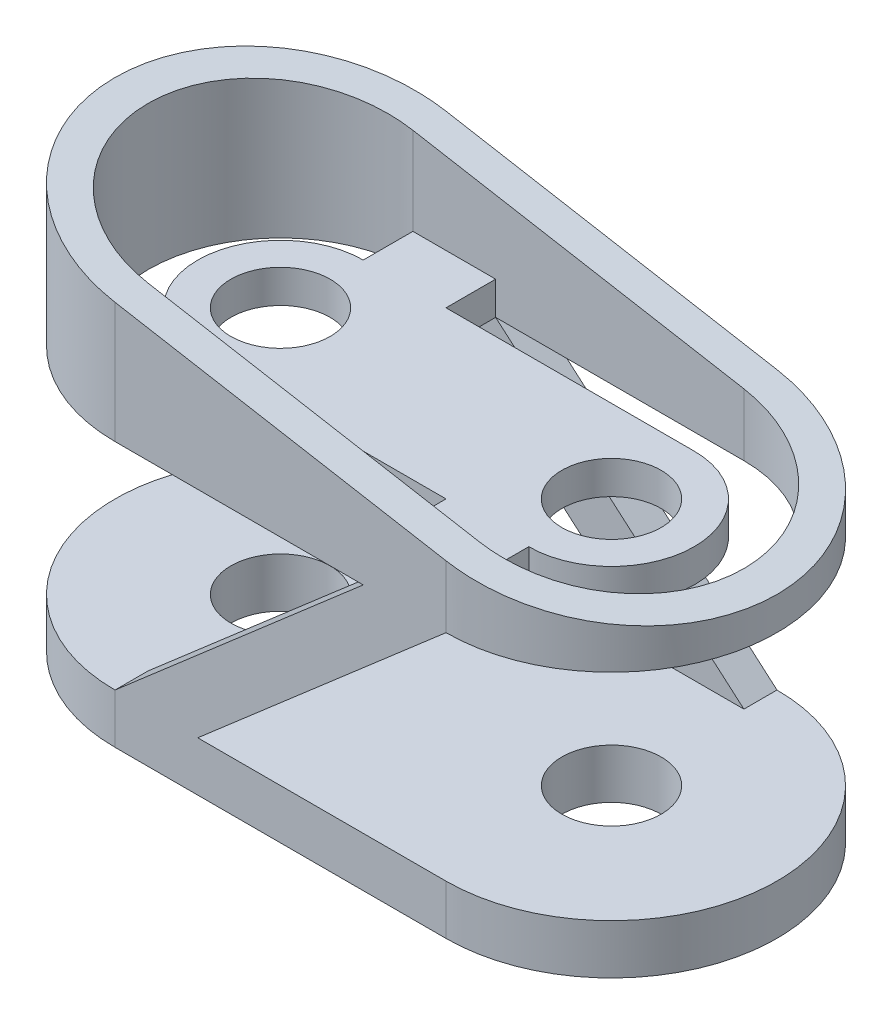
ISO-10303-21;
HEADER;
FILE_DESCRIPTION(('STEP AP214'),'2;1');
FILE_NAME('part.step','',(''),(''),'','','');
FILE_SCHEMA(('AUTOMOTIVE_DESIGN { 1 0 10303 214 1 1 1 1 }'));
ENDSEC;
DATA;
#1=APPLICATION_CONTEXT('core data for automotive mechanical design processes');
#2=APPLICATION_PROTOCOL_DEFINITION('international standard','automotive_design',2000,#1);
#3=PRODUCT_CONTEXT('',#1,'mechanical');
#4=PRODUCT('Part','Part','',(#3));
#5=PRODUCT_RELATED_PRODUCT_CATEGORY('part','',(#4));
#6=PRODUCT_DEFINITION_FORMATION('','',#4);
#7=PRODUCT_DEFINITION_CONTEXT('part definition',#1,'design');
#8=PRODUCT_DEFINITION('design','',#6,#7);
#9=PRODUCT_DEFINITION_SHAPE('','',#8);
#10=(LENGTH_UNIT() NAMED_UNIT(*) SI_UNIT(.MILLI.,.METRE.));
#11=(NAMED_UNIT(*) PLANE_ANGLE_UNIT() SI_UNIT($,.RADIAN.));
#12=(NAMED_UNIT(*) SI_UNIT($,.STERADIAN.) SOLID_ANGLE_UNIT());
#13=UNCERTAINTY_MEASURE_WITH_UNIT(LENGTH_MEASURE(1.E-05),#10,'distance_accuracy_value','');
#14=(GEOMETRIC_REPRESENTATION_CONTEXT(3) GLOBAL_UNCERTAINTY_ASSIGNED_CONTEXT((#13)) GLOBAL_UNIT_ASSIGNED_CONTEXT((#10,
#11,#12)) REPRESENTATION_CONTEXT('',''));
#15=CARTESIAN_POINT('',(0.,0.,0.));
#16=DIRECTION('',(0.,0.,1.));
#17=DIRECTION('',(1.,0.,0.));
#18=AXIS2_PLACEMENT_3D('',#15,#16,#17);
#19=CARTESIAN_POINT('',(-50.,90.,0.));
#20=DIRECTION('',(0.,1.,0.));
#21=DIRECTION('',(0.,0.,1.));
#22=AXIS2_PLACEMENT_3D('',#19,#20,#21);
#23=PLANE('',#22);
#24=CARTESIAN_POINT('',(-50.,90.,0.));
#25=DIRECTION('',(0.,1.,0.));
#26=DIRECTION('',(0.,0.,1.));
#27=AXIS2_PLACEMENT_3D('',#24,#25,#26);
#28=CIRCLE('',#27,15.);
#29=CARTESIAN_POINT('',(-50.,90.,15.));
#30=VERTEX_POINT('',#29);
#31=EDGE_CURVE('E312',#30,#30,#28,.T.);
#32=ORIENTED_EDGE('',*,*,#31,.F.);
#33=EDGE_LOOP('',(#32));
#34=FACE_BOUND('',#33,.T.);
#35=CARTESIAN_POINT('',(50.,90.,0.));
#36=DIRECTION('',(0.,1.,0.));
#37=DIRECTION('',(0.,0.,1.));
#38=AXIS2_PLACEMENT_3D('',#35,#36,#37);
#39=CIRCLE('',#38,15.);
#40=CARTESIAN_POINT('',(50.,90.,15.));
#41=VERTEX_POINT('',#40);
#42=EDGE_CURVE('E306',#41,#41,#39,.T.);
#43=ORIENTED_EDGE('',*,*,#42,.F.);
#44=EDGE_LOOP('',(#43));
#45=FACE_BOUND('',#44,.T.);
#46=DIRECTION('',(0.,0.,-1.));
#47=VECTOR('',#46,1.);
#48=CARTESIAN_POINT('',(25.,90.,50.));
#49=LINE('',#48,#47);
#50=CARTESIAN_POINT('',(25.,90.,40.));
#51=VERTEX_POINT('',#50);
#52=CARTESIAN_POINT('',(25.,90.,25.));
#53=VERTEX_POINT('',#52);
#54=EDGE_CURVE('E375',#51,#53,#49,.T.);
#55=ORIENTED_EDGE('',*,*,#54,.F.);
#56=DIRECTION('',(1.,0.,0.));
#57=VECTOR('',#56,1.);
#58=CARTESIAN_POINT('',(-50.,90.,40.));
#59=LINE('',#58,#57);
#60=CARTESIAN_POINT('',(50.,90.,40.));
#61=VERTEX_POINT('',#60);
#62=EDGE_CURVE('E298',#51,#61,#59,.T.);
#63=ORIENTED_EDGE('',*,*,#62,.T.);
#64=DIRECTION('',(0.,0.,1.));
#65=VECTOR('',#64,1.);
#66=CARTESIAN_POINT('',(50.,90.,25.));
#67=LINE('',#66,#65);
#68=CARTESIAN_POINT('',(50.,90.,25.));
#69=VERTEX_POINT('',#68);
#70=EDGE_CURVE('E371',#69,#61,#67,.T.);
#71=ORIENTED_EDGE('',*,*,#70,.F.);
#72=CARTESIAN_POINT('',(50.,90.,0.));
#73=DIRECTION('',(0.,1.,0.));
#74=DIRECTION('',(0.,0.,1.));
#75=AXIS2_PLACEMENT_3D('',#72,#73,#74);
#76=CIRCLE('',#75,25.);
#77=CARTESIAN_POINT('',(50.,90.,-25.));
#78=VERTEX_POINT('',#77);
#79=EDGE_CURVE('E367',#69,#78,#76,.T.);
#80=ORIENTED_EDGE('',*,*,#79,.T.);
#81=DIRECTION('',(-1.,0.,0.));
#82=VECTOR('',#81,1.);
#83=CARTESIAN_POINT('',(50.,90.,-25.));
#84=LINE('',#83,#82);
#85=CARTESIAN_POINT('',(-25.,90.,-25.));
#86=VERTEX_POINT('',#85);
#87=EDGE_CURVE('E363',#78,#86,#84,.T.);
#88=ORIENTED_EDGE('',*,*,#87,.T.);
#89=DIRECTION('',(0.,0.,-1.));
#90=VECTOR('',#89,1.);
#91=CARTESIAN_POINT('',(-25.,90.,-25.));
#92=LINE('',#91,#90);
#93=CARTESIAN_POINT('',(-25.,90.,-40.));
#94=VERTEX_POINT('',#93);
#95=EDGE_CURVE('E359',#86,#94,#92,.T.);
#96=ORIENTED_EDGE('',*,*,#95,.T.);
#97=DIRECTION('',(-1.,0.,0.));
#98=VECTOR('',#97,1.);
#99=CARTESIAN_POINT('',(-50.,90.,-40.));
#100=LINE('',#99,#98);
#101=CARTESIAN_POINT('',(-50.,90.,-40.));
#102=VERTEX_POINT('',#101);
#103=EDGE_CURVE('E303',#94,#102,#100,.T.);
#104=ORIENTED_EDGE('',*,*,#103,.T.);
#105=DIRECTION('',(0.,0.,-1.));
#106=VECTOR('',#105,1.);
#107=CARTESIAN_POINT('',(-50.,90.,-25.));
#108=LINE('',#107,#106);
#109=CARTESIAN_POINT('',(-50.,90.,-25.));
#110=VERTEX_POINT('',#109);
#111=EDGE_CURVE('E311',#110,#102,#108,.T.);
#112=ORIENTED_EDGE('',*,*,#111,.F.);
#113=CARTESIAN_POINT('',(-50.,90.,0.));
#114=DIRECTION('',(0.,1.,0.));
#115=DIRECTION('',(0.,0.,1.));
#116=AXIS2_PLACEMENT_3D('',#113,#114,#115);
#117=CIRCLE('',#116,25.);
#118=CARTESIAN_POINT('',(-50.,90.,25.));
#119=VERTEX_POINT('',#118);
#120=EDGE_CURVE('E328',#110,#119,#117,.T.);
#121=ORIENTED_EDGE('',*,*,#120,.T.);
#122=DIRECTION('',(1.,0.,0.));
#123=VECTOR('',#122,1.);
#124=CARTESIAN_POINT('',(-50.,90.,25.));
#125=LINE('',#124,#123);
#126=EDGE_CURVE('E378',#119,#53,#125,.T.);
#127=ORIENTED_EDGE('',*,*,#126,.T.);
#128=EDGE_LOOP('',(#55,#63,#71,#80,#88,#96,#104,#112,#121,#127));
#129=FACE_BOUND('',#128,.T.);
#130=ADVANCED_FACE('F84',(#34,#45,#129),#23,.T.);
#131=CARTESIAN_POINT('',(-50.,80.,-25.));
#132=DIRECTION('',(1.,0.,0.));
#133=DIRECTION('',(0.,0.,-1.));
#134=AXIS2_PLACEMENT_3D('',#131,#132,#133);
#135=PLANE('',#134);
#136=DIRECTION('',(0.,1.,0.));
#137=VECTOR('',#136,1.);
#138=CARTESIAN_POINT('',(-50.,80.,-40.));
#139=LINE('',#138,#137);
#140=CARTESIAN_POINT('',(-50.,80.,-40.));
#141=VERTEX_POINT('',#140);
#142=EDGE_CURVE('E277',#141,#102,#139,.T.);
#143=ORIENTED_EDGE('',*,*,#142,.F.);
#144=DIRECTION('',(0.,0.,-1.));
#145=VECTOR('',#144,1.);
#146=CARTESIAN_POINT('',(-50.,80.,-25.));
#147=LINE('',#146,#145);
#148=CARTESIAN_POINT('',(-50.,80.,-25.));
#149=VERTEX_POINT('',#148);
#150=EDGE_CURVE('E323',#149,#141,#147,.T.);
#151=ORIENTED_EDGE('',*,*,#150,.F.);
#152=DIRECTION('',(0.,1.,0.));
#153=VECTOR('',#152,1.);
#154=CARTESIAN_POINT('',(-50.,80.,-25.));
#155=LINE('',#154,#153);
#156=EDGE_CURVE('E355',#149,#110,#155,.T.);
#157=ORIENTED_EDGE('',*,*,#156,.T.);
#158=ORIENTED_EDGE('',*,*,#111,.T.);
#159=EDGE_LOOP('',(#143,#151,#157,#158));
#160=FACE_BOUND('',#159,.T.);
#161=ADVANCED_FACE('F563',(#160),#135,.F.);
#162=CARTESIAN_POINT('',(25.,80.,50.));
#163=DIRECTION('',(1.,0.,0.));
#164=DIRECTION('',(0.,0.,-1.));
#165=AXIS2_PLACEMENT_3D('',#162,#163,#164);
#166=PLANE('',#165);
#167=DIRECTION('',(0.,-1.,0.));
#168=VECTOR('',#167,1.);
#169=CARTESIAN_POINT('',(25.,80.,40.));
#170=LINE('',#169,#168);
#171=CARTESIAN_POINT('',(25.,80.,40.));
#172=VERTEX_POINT('',#171);
#173=EDGE_CURVE('E295',#51,#172,#170,.T.);
#174=ORIENTED_EDGE('',*,*,#173,.F.);
#175=ORIENTED_EDGE('',*,*,#54,.T.);
#176=DIRECTION('',(0.,1.,0.));
#177=VECTOR('',#176,1.);
#178=CARTESIAN_POINT('',(25.,80.,25.));
#179=LINE('',#178,#177);
#180=CARTESIAN_POINT('',(25.,80.,25.));
#181=VERTEX_POINT('',#180);
#182=EDGE_CURVE('E390',#181,#53,#179,.T.);
#183=ORIENTED_EDGE('',*,*,#182,.F.);
#184=DIRECTION('',(0.,0.,-1.));
#185=VECTOR('',#184,1.);
#186=CARTESIAN_POINT('',(25.,80.,50.));
#187=LINE('',#186,#185);
#188=EDGE_CURVE('E343',#172,#181,#187,.T.);
#189=ORIENTED_EDGE('',*,*,#188,.F.);
#190=EDGE_LOOP('',(#174,#175,#183,#189));
#191=FACE_BOUND('',#190,.T.);
#192=ADVANCED_FACE('F690',(#191),#166,.F.);
#193=CARTESIAN_POINT('',(-25.,80.,-25.));
#194=DIRECTION('',(1.,0.,0.));
#195=DIRECTION('',(0.,0.,-1.));
#196=AXIS2_PLACEMENT_3D('',#193,#194,#195);
#197=PLANE('',#196);
#198=DIRECTION('',(0.,0.,-1.));
#199=VECTOR('',#198,1.);
#200=CARTESIAN_POINT('',(-25.,80.,-25.));
#201=LINE('',#200,#199);
#202=CARTESIAN_POINT('',(-25.,80.,-25.));
#203=VERTEX_POINT('',#202);
#204=CARTESIAN_POINT('',(-25.,80.,-40.));
#205=VERTEX_POINT('',#204);
#206=EDGE_CURVE('E327',#203,#205,#201,.T.);
#207=ORIENTED_EDGE('',*,*,#206,.T.);
#208=DIRECTION('',(0.,1.,0.));
#209=VECTOR('',#208,1.);
#210=CARTESIAN_POINT('',(-25.,80.,-40.));
#211=LINE('',#210,#209);
#212=EDGE_CURVE('E93',#205,#94,#211,.T.);
#213=ORIENTED_EDGE('',*,*,#212,.T.);
#214=ORIENTED_EDGE('',*,*,#95,.F.);
#215=DIRECTION('',(0.,1.,0.));
#216=VECTOR('',#215,1.);
#217=CARTESIAN_POINT('',(-25.,80.,-25.));
#218=LINE('',#217,#216);
#219=EDGE_CURVE('E400',#203,#86,#218,.T.);
#220=ORIENTED_EDGE('',*,*,#219,.F.);
#221=EDGE_LOOP('',(#207,#213,#214,#220));
#222=FACE_BOUND('',#221,.T.);
#223=ADVANCED_FACE('F546',(#222),#197,.T.);
#224=CARTESIAN_POINT('',(50.,80.,25.));
#225=DIRECTION('',(-1.,0.,0.));
#226=DIRECTION('',(0.,0.,1.));
#227=AXIS2_PLACEMENT_3D('',#224,#225,#226);
#228=PLANE('',#227);
#229=DIRECTION('',(0.,1.,0.));
#230=VECTOR('',#229,1.);
#231=CARTESIAN_POINT('',(50.,80.,40.));
#232=LINE('',#231,#230);
#233=CARTESIAN_POINT('',(50.,80.,40.));
#234=VERTEX_POINT('',#233);
#235=EDGE_CURVE('E281',#234,#61,#232,.T.);
#236=ORIENTED_EDGE('',*,*,#235,.F.);
#237=DIRECTION('',(0.,0.,1.));
#238=VECTOR('',#237,1.);
#239=CARTESIAN_POINT('',(50.,80.,25.));
#240=LINE('',#239,#238);
#241=CARTESIAN_POINT('',(50.,80.,25.));
#242=VERTEX_POINT('',#241);
#243=EDGE_CURVE('E339',#242,#234,#240,.T.);
#244=ORIENTED_EDGE('',*,*,#243,.F.);
#245=DIRECTION('',(0.,1.,0.));
#246=VECTOR('',#245,1.);
#247=CARTESIAN_POINT('',(50.,80.,25.));
#248=LINE('',#247,#246);
#249=EDGE_CURVE('E394',#242,#69,#248,.T.);
#250=ORIENTED_EDGE('',*,*,#249,.T.);
#251=ORIENTED_EDGE('',*,*,#70,.T.);
#252=EDGE_LOOP('',(#236,#244,#250,#251));
#253=FACE_BOUND('',#252,.T.);
#254=ADVANCED_FACE('F617',(#253),#228,.F.);
#255=CARTESIAN_POINT('',(-50.,15.,-50.));
#256=DIRECTION('',(0.,0.,1.));
#257=DIRECTION('',(1.,0.,0.));
#258=AXIS2_PLACEMENT_3D('',#255,#256,#257);
#259=PLANE('',#258);
#260=DIRECTION('',(0.,-1.,0.));
#261=VECTOR('',#260,1.);
#262=CARTESIAN_POINT('',(-50.,90.,-50.));
#263=LINE('',#262,#261);
#264=CARTESIAN_POINT('',(-50.,116.44904710627,-50.));
#265=VERTEX_POINT('',#264);
#266=CARTESIAN_POINT('',(-50.,80.,-50.));
#267=VERTEX_POINT('',#266);
#268=EDGE_CURVE('E431',#265,#267,#263,.T.);
#269=ORIENTED_EDGE('',*,*,#268,.F.);
#270=DIRECTION('',(0.984807753012208,-0.173648177666931,0.));
#271=VECTOR('',#270,1.);
#272=CARTESIAN_POINT('',(-32.6511911842305,113.389984028897,-50.));
#273=LINE('',#272,#271);
#274=CARTESIAN_POINT('',(50.,98.8163490354233,-50.));
#275=VERTEX_POINT('',#274);
#276=EDGE_CURVE('E655',#265,#275,#273,.T.);
#277=ORIENTED_EDGE('',*,*,#276,.T.);
#278=DIRECTION('',(0.,1.,0.));
#279=VECTOR('',#278,1.);
#280=CARTESIAN_POINT('',(50.,80.,-50.));
#281=LINE('',#280,#279);
#282=CARTESIAN_POINT('',(50.,80.,-50.));
#283=VERTEX_POINT('',#282);
#284=EDGE_CURVE('E291',#283,#275,#281,.T.);
#285=ORIENTED_EDGE('',*,*,#284,.F.);
#286=DIRECTION('',(-1.,0.,0.));
#287=VECTOR('',#286,1.);
#288=CARTESIAN_POINT('',(0.,80.,-50.));
#289=LINE('',#288,#287);
#290=CARTESIAN_POINT('',(-25.,80.,-50.));
#291=VERTEX_POINT('',#290);
#292=EDGE_CURVE('E590',#283,#291,#289,.T.);
#293=ORIENTED_EDGE('',*,*,#292,.T.);
#294=DIRECTION('',(0.755689082789818,-0.654930538417842,0.));
#295=VECTOR('',#294,1.);
#296=CARTESIAN_POINT('',(50.,15.,-50.));
#297=LINE('',#296,#295);
#298=CARTESIAN_POINT('',(50.,15.,-50.));
#299=VERTEX_POINT('',#298);
#300=EDGE_CURVE('E408',#291,#299,#297,.T.);
#301=ORIENTED_EDGE('',*,*,#300,.T.);
#302=DIRECTION('',(0.,-1.,0.));
#303=VECTOR('',#302,1.);
#304=CARTESIAN_POINT('',(50.,15.,-50.));
#305=LINE('',#304,#303);
#306=CARTESIAN_POINT('',(50.,0.,-50.));
#307=VERTEX_POINT('',#306);
#308=EDGE_CURVE('E532',#299,#307,#305,.T.);
#309=ORIENTED_EDGE('',*,*,#308,.T.);
#310=DIRECTION('',(-1.,0.,0.));
#311=VECTOR('',#310,1.);
#312=CARTESIAN_POINT('',(-50.,0.,-50.));
#313=LINE('',#312,#311);
#314=CARTESIAN_POINT('',(-50.,0.,-50.));
#315=VERTEX_POINT('',#314);
#316=EDGE_CURVE('E508',#307,#315,#313,.T.);
#317=ORIENTED_EDGE('',*,*,#316,.T.);
#318=DIRECTION('',(0.,-1.,0.));
#319=VECTOR('',#318,1.);
#320=CARTESIAN_POINT('',(-50.,15.,-50.));
#321=LINE('',#320,#319);
#322=CARTESIAN_POINT('',(-50.,15.,-50.));
#323=VERTEX_POINT('',#322);
#324=EDGE_CURVE('E517',#323,#315,#321,.T.);
#325=ORIENTED_EDGE('',*,*,#324,.F.);
#326=DIRECTION('',(-1.,0.,0.));
#327=VECTOR('',#326,1.);
#328=CARTESIAN_POINT('',(-50.,15.,-50.));
#329=LINE('',#328,#327);
#330=CARTESIAN_POINT('',(25.,15.,-50.));
#331=VERTEX_POINT('',#330);
#332=EDGE_CURVE('E514',#331,#323,#329,.T.);
#333=ORIENTED_EDGE('',*,*,#332,.F.);
#334=DIRECTION('',(-0.755689082789818,0.654930538417842,0.));
#335=VECTOR('',#334,1.);
#336=CARTESIAN_POINT('',(-50.,80.,-50.));
#337=LINE('',#336,#335);
#338=EDGE_CURVE('E403',#331,#267,#337,.T.);
#339=ORIENTED_EDGE('',*,*,#338,.T.);
#340=EDGE_LOOP('',(#269,#277,#285,#293,#301,#309,#317,#325,#333,#339));
#341=FACE_BOUND('',#340,.T.);
#342=ADVANCED_FACE('F654',(#341),#259,.F.);
#343=CARTESIAN_POINT('',(-50.,80.,0.));
#344=DIRECTION('',(0.,1.,0.));
#345=DIRECTION('',(0.,0.,1.));
#346=AXIS2_PLACEMENT_3D('',#343,#344,#345);
#347=PLANE('',#346);
#348=CARTESIAN_POINT('',(-50.,80.,0.));
#349=DIRECTION('',(0.,1.,0.));
#350=DIRECTION('',(0.,0.,1.));
#351=AXIS2_PLACEMENT_3D('',#348,#349,#350);
#352=CIRCLE('',#351,15.);
#353=CARTESIAN_POINT('',(-50.,80.,15.));
#354=VERTEX_POINT('',#353);
#355=EDGE_CURVE('E307',#354,#354,#352,.T.);
#356=ORIENTED_EDGE('',*,*,#355,.T.);
#357=EDGE_LOOP('',(#356));
#358=FACE_BOUND('',#357,.T.);
#359=CARTESIAN_POINT('',(50.,80.,0.));
#360=DIRECTION('',(0.,1.,0.));
#361=DIRECTION('',(0.,0.,1.));
#362=AXIS2_PLACEMENT_3D('',#359,#360,#361);
#363=CIRCLE('',#362,15.);
#364=CARTESIAN_POINT('',(50.,80.,15.));
#365=VERTEX_POINT('',#364);
#366=EDGE_CURVE('E316',#365,#365,#363,.T.);
#367=ORIENTED_EDGE('',*,*,#366,.T.);
#368=EDGE_LOOP('',(#367));
#369=FACE_BOUND('',#368,.T.);
#370=ORIENTED_EDGE('',*,*,#206,.F.);
#371=DIRECTION('',(-1.,0.,0.));
#372=VECTOR('',#371,1.);
#373=CARTESIAN_POINT('',(50.,80.,-25.));
#374=LINE('',#373,#372);
#375=CARTESIAN_POINT('',(50.,80.,-25.));
#376=VERTEX_POINT('',#375);
#377=EDGE_CURVE('E331',#376,#203,#374,.T.);
#378=ORIENTED_EDGE('',*,*,#377,.F.);
#379=CARTESIAN_POINT('',(50.,80.,0.));
#380=DIRECTION('',(0.,1.,0.));
#381=DIRECTION('',(0.,0.,1.));
#382=AXIS2_PLACEMENT_3D('',#379,#380,#381);
#383=CIRCLE('',#382,25.);
#384=EDGE_CURVE('E335',#242,#376,#383,.T.);
#385=ORIENTED_EDGE('',*,*,#384,.F.);
#386=ORIENTED_EDGE('',*,*,#243,.T.);
#387=DIRECTION('',(-1.,0.,0.));
#388=VECTOR('',#387,1.);
#389=CARTESIAN_POINT('',(25.,80.,40.));
#390=LINE('',#389,#388);
#391=EDGE_CURVE('E458',#234,#172,#390,.T.);
#392=ORIENTED_EDGE('',*,*,#391,.T.);
#393=ORIENTED_EDGE('',*,*,#188,.T.);
#394=DIRECTION('',(1.,0.,0.));
#395=VECTOR('',#394,1.);
#396=CARTESIAN_POINT('',(-50.,80.,25.));
#397=LINE('',#396,#395);
#398=CARTESIAN_POINT('',(-50.,80.,25.));
#399=VERTEX_POINT('',#398);
#400=EDGE_CURVE('E347',#399,#181,#397,.T.);
#401=ORIENTED_EDGE('',*,*,#400,.F.);
#402=CARTESIAN_POINT('',(-50.,80.,0.));
#403=DIRECTION('',(0.,1.,0.));
#404=DIRECTION('',(0.,0.,1.));
#405=AXIS2_PLACEMENT_3D('',#402,#403,#404);
#406=CIRCLE('',#405,25.);
#407=EDGE_CURVE('E351',#149,#399,#406,.T.);
#408=ORIENTED_EDGE('',*,*,#407,.F.);
#409=ORIENTED_EDGE('',*,*,#150,.T.);
#410=DIRECTION('',(1.,0.,0.));
#411=VECTOR('',#410,1.);
#412=CARTESIAN_POINT('',(-25.,80.,-40.));
#413=LINE('',#412,#411);
#414=EDGE_CURVE('E412',#141,#205,#413,.T.);
#415=ORIENTED_EDGE('',*,*,#414,.T.);
#416=EDGE_LOOP('',(#370,#378,#385,#386,#392,#393,#401,#408,#409,#415));
#417=FACE_BOUND('',#416,.T.);
#418=ADVANCED_FACE('F567',(#358,#369,#417),#347,.F.);
#419=CARTESIAN_POINT('',(-50.,15.,0.));
#420=DIRECTION('',(0.,-1.,0.));
#421=DIRECTION('',(0.,0.,-1.));
#422=AXIS2_PLACEMENT_3D('',#419,#420,#421);
#423=CYLINDRICAL_SURFACE('',#422,50.);
#424=CARTESIAN_POINT('',(-50.,0.,0.));
#425=DIRECTION('',(0.,1.,0.));
#426=DIRECTION('',(0.,0.,1.));
#427=AXIS2_PLACEMENT_3D('',#424,#425,#426);
#428=CIRCLE('',#427,50.);
#429=CARTESIAN_POINT('',(-50.,0.,50.));
#430=VERTEX_POINT('',#429);
#431=EDGE_CURVE('E491',#315,#430,#428,.T.);
#432=ORIENTED_EDGE('',*,*,#431,.T.);
#433=DIRECTION('',(0.,-1.,0.));
#434=VECTOR('',#433,1.);
#435=CARTESIAN_POINT('',(-50.,15.,50.));
#436=LINE('',#435,#434);
#437=CARTESIAN_POINT('',(-50.,15.,50.));
#438=VERTEX_POINT('',#437);
#439=EDGE_CURVE('E540',#438,#430,#436,.T.);
#440=ORIENTED_EDGE('',*,*,#439,.F.);
#441=CARTESIAN_POINT('',(-50.,15.,0.));
#442=DIRECTION('',(0.,1.,0.));
#443=DIRECTION('',(0.,0.,1.));
#444=AXIS2_PLACEMENT_3D('',#441,#442,#443);
#445=CIRCLE('',#444,50.);
#446=EDGE_CURVE('E503',#323,#438,#445,.T.);
#447=ORIENTED_EDGE('',*,*,#446,.F.);
#448=ORIENTED_EDGE('',*,*,#324,.T.);
#449=EDGE_LOOP('',(#432,#440,#447,#448));
#450=FACE_BOUND('',#449,.T.);
#451=ADVANCED_FACE('F86',(#450),#423,.T.);
#452=CARTESIAN_POINT('',(-50.,15.,50.));
#453=DIRECTION('',(0.,0.,-1.));
#454=DIRECTION('',(-1.,0.,0.));
#455=AXIS2_PLACEMENT_3D('',#452,#453,#454);
#456=PLANE('',#455);
#457=DIRECTION('',(0.,-1.,0.));
#458=VECTOR('',#457,1.);
#459=CARTESIAN_POINT('',(50.,90.,50.));
#460=LINE('',#459,#458);
#461=CARTESIAN_POINT('',(50.,98.8163490354233,50.));
#462=VERTEX_POINT('',#461);
#463=CARTESIAN_POINT('',(50.,80.,50.));
#464=VERTEX_POINT('',#463);
#465=EDGE_CURVE('E445',#462,#464,#460,.T.);
#466=ORIENTED_EDGE('',*,*,#465,.F.);
#467=DIRECTION('',(-0.984807753012208,0.173648177666931,0.));
#468=VECTOR('',#467,1.);
#469=CARTESIAN_POINT('',(-32.6511911842305,113.389984028897,50.));
#470=LINE('',#469,#468);
#471=CARTESIAN_POINT('',(-50.,116.44904710627,50.));
#472=VERTEX_POINT('',#471);
#473=EDGE_CURVE('E663',#462,#472,#470,.T.);
#474=ORIENTED_EDGE('',*,*,#473,.T.);
#475=DIRECTION('',(0.,1.,0.));
#476=VECTOR('',#475,1.);
#477=CARTESIAN_POINT('',(-50.,80.,50.));
#478=LINE('',#477,#476);
#479=CARTESIAN_POINT('',(-50.,80.,50.));
#480=VERTEX_POINT('',#479);
#481=EDGE_CURVE('E288',#480,#472,#478,.T.);
#482=ORIENTED_EDGE('',*,*,#481,.F.);
#483=DIRECTION('',(1.,0.,0.));
#484=VECTOR('',#483,1.);
#485=CARTESIAN_POINT('',(0.,80.,50.));
#486=LINE('',#485,#484);
#487=CARTESIAN_POINT('',(25.,80.,50.));
#488=VERTEX_POINT('',#487);
#489=EDGE_CURVE('E587',#480,#488,#486,.T.);
#490=ORIENTED_EDGE('',*,*,#489,.T.);
#491=DIRECTION('',(-0.755689082789818,-0.654930538417842,0.));
#492=VECTOR('',#491,1.);
#493=CARTESIAN_POINT('',(-50.,15.,50.));
#494=LINE('',#493,#492);
#495=EDGE_CURVE('E454',#488,#438,#494,.T.);
#496=ORIENTED_EDGE('',*,*,#495,.T.);
#497=ORIENTED_EDGE('',*,*,#439,.T.);
#498=DIRECTION('',(1.,0.,0.));
#499=VECTOR('',#498,1.);
#500=CARTESIAN_POINT('',(-50.,0.,50.));
#501=LINE('',#500,#499);
#502=CARTESIAN_POINT('',(50.,0.,50.));
#503=VERTEX_POINT('',#502);
#504=EDGE_CURVE('E521',#430,#503,#501,.T.);
#505=ORIENTED_EDGE('',*,*,#504,.T.);
#506=DIRECTION('',(0.,-1.,0.));
#507=VECTOR('',#506,1.);
#508=CARTESIAN_POINT('',(50.,15.,50.));
#509=LINE('',#508,#507);
#510=CARTESIAN_POINT('',(50.,15.,50.));
#511=VERTEX_POINT('',#510);
#512=EDGE_CURVE('E536',#511,#503,#509,.T.);
#513=ORIENTED_EDGE('',*,*,#512,.F.);
#514=DIRECTION('',(1.,0.,0.));
#515=VECTOR('',#514,1.);
#516=CARTESIAN_POINT('',(-50.,15.,50.));
#517=LINE('',#516,#515);
#518=CARTESIAN_POINT('',(-25.,15.,50.));
#519=VERTEX_POINT('',#518);
#520=EDGE_CURVE('E507',#519,#511,#517,.T.);
#521=ORIENTED_EDGE('',*,*,#520,.F.);
#522=DIRECTION('',(0.755689082789818,0.654930538417842,0.));
#523=VECTOR('',#522,1.);
#524=CARTESIAN_POINT('',(-25.,15.,50.));
#525=LINE('',#524,#523);
#526=EDGE_CURVE('E448',#519,#464,#525,.T.);
#527=ORIENTED_EDGE('',*,*,#526,.T.);
#528=EDGE_LOOP('',(#466,#474,#482,#490,#496,#497,#505,#513,#521,#527));
#529=FACE_BOUND('',#528,.T.);
#530=ADVANCED_FACE('F639',(#529),#456,.F.);
#531=CARTESIAN_POINT('',(50.,15.,0.));
#532=DIRECTION('',(0.,-1.,0.));
#533=DIRECTION('',(0.,0.,-1.));
#534=AXIS2_PLACEMENT_3D('',#531,#532,#533);
#535=CYLINDRICAL_SURFACE('',#534,50.);
#536=CARTESIAN_POINT('',(50.,0.,0.));
#537=DIRECTION('',(0.,1.,0.));
#538=DIRECTION('',(0.,0.,1.));
#539=AXIS2_PLACEMENT_3D('',#536,#537,#538);
#540=CIRCLE('',#539,50.);
#541=EDGE_CURVE('E524',#503,#307,#540,.T.);
#542=ORIENTED_EDGE('',*,*,#541,.T.);
#543=ORIENTED_EDGE('',*,*,#308,.F.);
#544=CARTESIAN_POINT('',(50.,15.,0.));
#545=DIRECTION('',(0.,1.,0.));
#546=DIRECTION('',(0.,0.,1.));
#547=AXIS2_PLACEMENT_3D('',#544,#545,#546);
#548=CIRCLE('',#547,50.);
#549=EDGE_CURVE('E511',#511,#299,#548,.T.);
#550=ORIENTED_EDGE('',*,*,#549,.F.);
#551=ORIENTED_EDGE('',*,*,#512,.T.);
#552=EDGE_LOOP('',(#542,#543,#550,#551));
#553=FACE_BOUND('',#552,.T.);
#554=ADVANCED_FACE('F644',(#553),#535,.T.);
#555=CARTESIAN_POINT('',(-50.,15.,0.));
#556=DIRECTION('',(0.,1.,0.));
#557=DIRECTION('',(0.,0.,1.));
#558=AXIS2_PLACEMENT_3D('',#555,#556,#557);
#559=PLANE('',#558);
#560=DIRECTION('',(0.,0.,-1.));
#561=VECTOR('',#560,1.);
#562=CARTESIAN_POINT('',(50.,15.,-40.));
#563=LINE('',#562,#561);
#564=CARTESIAN_POINT('',(50.,15.,-40.));
#565=VERTEX_POINT('',#564);
#566=EDGE_CURVE('E427',#565,#299,#563,.T.);
#567=ORIENTED_EDGE('',*,*,#566,.F.);
#568=DIRECTION('',(-1.,0.,0.));
#569=VECTOR('',#568,1.);
#570=CARTESIAN_POINT('',(50.,15.,-40.));
#571=LINE('',#570,#569);
#572=CARTESIAN_POINT('',(25.,15.,-40.));
#573=VERTEX_POINT('',#572);
#574=EDGE_CURVE('E404',#565,#573,#571,.T.);
#575=ORIENTED_EDGE('',*,*,#574,.T.);
#576=DIRECTION('',(0.,0.,-1.));
#577=VECTOR('',#576,1.);
#578=CARTESIAN_POINT('',(25.,15.,-40.));
#579=LINE('',#578,#577);
#580=EDGE_CURVE('E420',#573,#331,#579,.T.);
#581=ORIENTED_EDGE('',*,*,#580,.T.);
#582=ORIENTED_EDGE('',*,*,#332,.T.);
#583=ORIENTED_EDGE('',*,*,#446,.T.);
#584=DIRECTION('',(0.,0.,1.));
#585=VECTOR('',#584,1.);
#586=CARTESIAN_POINT('',(-50.,15.,40.));
#587=LINE('',#586,#585);
#588=CARTESIAN_POINT('',(-50.,15.,40.));
#589=VERTEX_POINT('',#588);
#590=EDGE_CURVE('E473',#589,#438,#587,.T.);
#591=ORIENTED_EDGE('',*,*,#590,.F.);
#592=DIRECTION('',(1.,0.,0.));
#593=VECTOR('',#592,1.);
#594=CARTESIAN_POINT('',(-50.,15.,40.));
#595=LINE('',#594,#593);
#596=CARTESIAN_POINT('',(-25.,15.,40.));
#597=VERTEX_POINT('',#596);
#598=EDGE_CURVE('E449',#589,#597,#595,.T.);
#599=ORIENTED_EDGE('',*,*,#598,.T.);
#600=DIRECTION('',(0.,0.,1.));
#601=VECTOR('',#600,1.);
#602=CARTESIAN_POINT('',(-25.,15.,40.));
#603=LINE('',#602,#601);
#604=EDGE_CURVE('E466',#597,#519,#603,.T.);
#605=ORIENTED_EDGE('',*,*,#604,.T.);
#606=ORIENTED_EDGE('',*,*,#520,.T.);
#607=ORIENTED_EDGE('',*,*,#549,.T.);
#608=EDGE_LOOP('',(#567,#575,#581,#582,#583,#591,#599,#605,#606,#607));
#609=FACE_BOUND('',#608,.T.);
#610=CARTESIAN_POINT('',(50.,15.,0.));
#611=DIRECTION('',(0.,1.,0.));
#612=DIRECTION('',(0.,0.,1.));
#613=AXIS2_PLACEMENT_3D('',#610,#611,#612);
#614=CIRCLE('',#613,15.);
#615=CARTESIAN_POINT('',(50.,15.,15.));
#616=VERTEX_POINT('',#615);
#617=EDGE_CURVE('E492',#616,#616,#614,.T.);
#618=ORIENTED_EDGE('',*,*,#617,.F.);
#619=EDGE_LOOP('',(#618));
#620=FACE_BOUND('',#619,.T.);
#621=CARTESIAN_POINT('',(-50.,15.,0.));
#622=DIRECTION('',(0.,1.,0.));
#623=DIRECTION('',(0.,0.,1.));
#624=AXIS2_PLACEMENT_3D('',#621,#622,#623);
#625=CIRCLE('',#624,15.);
#626=CARTESIAN_POINT('',(-50.,15.,15.));
#627=VERTEX_POINT('',#626);
#628=EDGE_CURVE('E476',#627,#627,#625,.T.);
#629=ORIENTED_EDGE('',*,*,#628,.F.);
#630=EDGE_LOOP('',(#629));
#631=FACE_BOUND('',#630,.T.);
#632=ADVANCED_FACE('F634',(#609,#620,#631),#559,.T.);
#633=CARTESIAN_POINT('',(-50.,0.,0.));
#634=DIRECTION('',(0.,1.,0.));
#635=DIRECTION('',(0.,0.,1.));
#636=AXIS2_PLACEMENT_3D('',#633,#634,#635);
#637=PLANE('',#636);
#638=CARTESIAN_POINT('',(50.,0.,0.));
#639=DIRECTION('',(0.,1.,0.));
#640=DIRECTION('',(0.,0.,1.));
#641=AXIS2_PLACEMENT_3D('',#638,#639,#640);
#642=CIRCLE('',#641,15.);
#643=CARTESIAN_POINT('',(50.,0.,15.));
#644=VERTEX_POINT('',#643);
#645=EDGE_CURVE('E487',#644,#644,#642,.T.);
#646=ORIENTED_EDGE('',*,*,#645,.T.);
#647=EDGE_LOOP('',(#646));
#648=FACE_BOUND('',#647,.T.);
#649=CARTESIAN_POINT('',(-50.,0.,0.));
#650=DIRECTION('',(0.,1.,0.));
#651=DIRECTION('',(0.,0.,1.));
#652=AXIS2_PLACEMENT_3D('',#649,#650,#651);
#653=CIRCLE('',#652,15.);
#654=CARTESIAN_POINT('',(-50.,0.,15.));
#655=VERTEX_POINT('',#654);
#656=EDGE_CURVE('E496',#655,#655,#653,.T.);
#657=ORIENTED_EDGE('',*,*,#656,.T.);
#658=EDGE_LOOP('',(#657));
#659=FACE_BOUND('',#658,.T.);
#660=ORIENTED_EDGE('',*,*,#431,.F.);
#661=ORIENTED_EDGE('',*,*,#316,.F.);
#662=ORIENTED_EDGE('',*,*,#541,.F.);
#663=ORIENTED_EDGE('',*,*,#504,.F.);
#664=EDGE_LOOP('',(#660,#661,#662,#663));
#665=FACE_BOUND('',#664,.T.);
#666=ADVANCED_FACE('F715',(#648,#659,#665),#637,.F.);
#667=CARTESIAN_POINT('',(-50.,0.,0.));
#668=DIRECTION('',(0.,1.,0.));
#669=DIRECTION('',(0.,0.,1.));
#670=AXIS2_PLACEMENT_3D('',#667,#668,#669);
#671=CYLINDRICAL_SURFACE('',#670,15.);
#672=ORIENTED_EDGE('',*,*,#656,.F.);
#673=EDGE_LOOP('',(#672));
#674=FACE_BOUND('',#673,.T.);
#675=ORIENTED_EDGE('',*,*,#628,.T.);
#676=EDGE_LOOP('',(#675));
#677=FACE_BOUND('',#676,.T.);
#678=ADVANCED_FACE('F711',(#674,#677),#671,.F.);
#679=CARTESIAN_POINT('',(50.,0.,0.));
#680=DIRECTION('',(0.,1.,0.));
#681=DIRECTION('',(0.,0.,1.));
#682=AXIS2_PLACEMENT_3D('',#679,#680,#681);
#683=CYLINDRICAL_SURFACE('',#682,15.);
#684=ORIENTED_EDGE('',*,*,#645,.F.);
#685=EDGE_LOOP('',(#684));
#686=FACE_BOUND('',#685,.T.);
#687=ORIENTED_EDGE('',*,*,#617,.T.);
#688=EDGE_LOOP('',(#687));
#689=FACE_BOUND('',#688,.T.);
#690=ADVANCED_FACE('F705',(#686,#689),#683,.F.);
#691=CARTESIAN_POINT('',(-50.,15.,40.));
#692=DIRECTION('',(-0.654930538417842,0.755689082789818,0.));
#693=DIRECTION('',(-0.755689082789818,-0.654930538417842,0.));
#694=AXIS2_PLACEMENT_3D('',#691,#692,#693);
#695=PLANE('',#694);
#696=ORIENTED_EDGE('',*,*,#495,.F.);
#697=DIRECTION('',(0.,0.,1.));
#698=VECTOR('',#697,1.);
#699=CARTESIAN_POINT('',(25.,80.,40.));
#700=LINE('',#699,#698);
#701=EDGE_CURVE('E477',#172,#488,#700,.T.);
#702=ORIENTED_EDGE('',*,*,#701,.F.);
#703=DIRECTION('',(-0.755689082789818,-0.654930538417842,0.));
#704=VECTOR('',#703,1.);
#705=CARTESIAN_POINT('',(-50.,15.,40.));
#706=LINE('',#705,#704);
#707=EDGE_CURVE('E462',#172,#589,#706,.T.);
#708=ORIENTED_EDGE('',*,*,#707,.T.);
#709=ORIENTED_EDGE('',*,*,#590,.T.);
#710=EDGE_LOOP('',(#696,#702,#708,#709));
#711=FACE_BOUND('',#710,.T.);
#712=ADVANCED_FACE('F702',(#711),#695,.T.);
#713=CARTESIAN_POINT('',(-25.,15.,40.));
#714=DIRECTION('',(0.654930538417842,-0.755689082789818,0.));
#715=DIRECTION('',(0.755689082789818,0.654930538417842,0.));
#716=AXIS2_PLACEMENT_3D('',#713,#714,#715);
#717=PLANE('',#716);
#718=ORIENTED_EDGE('',*,*,#526,.F.);
#719=ORIENTED_EDGE('',*,*,#604,.F.);
#720=DIRECTION('',(0.755689082789818,0.654930538417842,0.));
#721=VECTOR('',#720,1.);
#722=CARTESIAN_POINT('',(-25.,15.,40.));
#723=LINE('',#722,#721);
#724=EDGE_CURVE('E453',#597,#234,#723,.T.);
#725=ORIENTED_EDGE('',*,*,#724,.T.);
#726=DIRECTION('',(0.,0.,1.));
#727=VECTOR('',#726,1.);
#728=CARTESIAN_POINT('',(50.,80.,40.));
#729=LINE('',#728,#727);
#730=EDGE_CURVE('E480',#234,#464,#729,.T.);
#731=ORIENTED_EDGE('',*,*,#730,.T.);
#732=EDGE_LOOP('',(#718,#719,#725,#731));
#733=FACE_BOUND('',#732,.T.);
#734=ADVANCED_FACE('F631',(#733),#717,.T.);
#735=CARTESIAN_POINT('',(0.,0.,40.));
#736=DIRECTION('',(0.,0.,1.));
#737=DIRECTION('',(1.,0.,0.));
#738=AXIS2_PLACEMENT_3D('',#735,#736,#737);
#739=PLANE('',#738);
#740=ORIENTED_EDGE('',*,*,#598,.F.);
#741=ORIENTED_EDGE('',*,*,#707,.F.);
#742=ORIENTED_EDGE('',*,*,#391,.F.);
#743=ORIENTED_EDGE('',*,*,#724,.F.);
#744=EDGE_LOOP('',(#740,#741,#742,#743));
#745=FACE_BOUND('',#744,.T.);
#746=ADVANCED_FACE('F629',(#745),#739,.F.);
#747=CARTESIAN_POINT('',(50.,15.,-40.));
#748=DIRECTION('',(0.654930538417842,0.755689082789818,0.));
#749=DIRECTION('',(-0.755689082789818,0.654930538417842,0.));
#750=AXIS2_PLACEMENT_3D('',#747,#748,#749);
#751=PLANE('',#750);
#752=ORIENTED_EDGE('',*,*,#300,.F.);
#753=DIRECTION('',(0.,0.,-1.));
#754=VECTOR('',#753,1.);
#755=CARTESIAN_POINT('',(-25.,80.,-40.));
#756=LINE('',#755,#754);
#757=EDGE_CURVE('E432',#205,#291,#756,.T.);
#758=ORIENTED_EDGE('',*,*,#757,.F.);
#759=DIRECTION('',(0.755689082789818,-0.654930538417842,0.));
#760=VECTOR('',#759,1.);
#761=CARTESIAN_POINT('',(50.,15.,-40.));
#762=LINE('',#761,#760);
#763=EDGE_CURVE('E416',#205,#565,#762,.T.);
#764=ORIENTED_EDGE('',*,*,#763,.T.);
#765=ORIENTED_EDGE('',*,*,#566,.T.);
#766=EDGE_LOOP('',(#752,#758,#764,#765));
#767=FACE_BOUND('',#766,.T.);
#768=ADVANCED_FACE('F646',(#767),#751,.T.);
#769=CARTESIAN_POINT('',(-50.,80.,-40.));
#770=DIRECTION('',(-0.654930538417842,-0.755689082789818,0.));
#771=DIRECTION('',(0.755689082789818,-0.654930538417842,0.));
#772=AXIS2_PLACEMENT_3D('',#769,#770,#771);
#773=PLANE('',#772);
#774=ORIENTED_EDGE('',*,*,#338,.F.);
#775=ORIENTED_EDGE('',*,*,#580,.F.);
#776=DIRECTION('',(-0.755689082789818,0.654930538417842,0.));
#777=VECTOR('',#776,1.);
#778=CARTESIAN_POINT('',(-50.,80.,-40.));
#779=LINE('',#778,#777);
#780=EDGE_CURVE('E407',#573,#141,#779,.T.);
#781=ORIENTED_EDGE('',*,*,#780,.T.);
#782=DIRECTION('',(0.,0.,-1.));
#783=VECTOR('',#782,1.);
#784=CARTESIAN_POINT('',(-50.,80.,-40.));
#785=LINE('',#784,#783);
#786=EDGE_CURVE('E436',#141,#267,#785,.T.);
#787=ORIENTED_EDGE('',*,*,#786,.T.);
#788=EDGE_LOOP('',(#774,#775,#781,#787));
#789=FACE_BOUND('',#788,.T.);
#790=ADVANCED_FACE('F578',(#789),#773,.T.);
#791=CARTESIAN_POINT('',(0.,0.,-40.));
#792=DIRECTION('',(0.,0.,1.));
#793=DIRECTION('',(1.,0.,0.));
#794=AXIS2_PLACEMENT_3D('',#791,#792,#793);
#795=PLANE('',#794);
#796=ORIENTED_EDGE('',*,*,#574,.F.);
#797=ORIENTED_EDGE('',*,*,#763,.F.);
#798=ORIENTED_EDGE('',*,*,#414,.F.);
#799=ORIENTED_EDGE('',*,*,#780,.F.);
#800=EDGE_LOOP('',(#796,#797,#798,#799));
#801=FACE_BOUND('',#800,.T.);
#802=ADVANCED_FACE('F573',(#801),#795,.T.);
#803=CARTESIAN_POINT('',(-50.,80.,0.));
#804=DIRECTION('',(0.,1.,0.));
#805=DIRECTION('',(0.,0.,1.));
#806=AXIS2_PLACEMENT_3D('',#803,#804,#805);
#807=CYLINDRICAL_SURFACE('',#806,25.);
#808=ORIENTED_EDGE('',*,*,#120,.F.);
#809=ORIENTED_EDGE('',*,*,#156,.F.);
#810=ORIENTED_EDGE('',*,*,#407,.T.);
#811=DIRECTION('',(0.,1.,0.));
#812=VECTOR('',#811,1.);
#813=CARTESIAN_POINT('',(-50.,80.,25.));
#814=LINE('',#813,#812);
#815=EDGE_CURVE('E387',#399,#119,#814,.T.);
#816=ORIENTED_EDGE('',*,*,#815,.T.);
#817=EDGE_LOOP('',(#808,#809,#810,#816));
#818=FACE_BOUND('',#817,.T.);
#819=ADVANCED_FACE('F758',(#818),#807,.T.);
#820=CARTESIAN_POINT('',(-50.,80.,25.));
#821=DIRECTION('',(0.,0.,1.));
#822=DIRECTION('',(1.,0.,0.));
#823=AXIS2_PLACEMENT_3D('',#820,#821,#822);
#824=PLANE('',#823);
#825=ORIENTED_EDGE('',*,*,#126,.F.);
#826=ORIENTED_EDGE('',*,*,#815,.F.);
#827=ORIENTED_EDGE('',*,*,#400,.T.);
#828=ORIENTED_EDGE('',*,*,#182,.T.);
#829=EDGE_LOOP('',(#825,#826,#827,#828));
#830=FACE_BOUND('',#829,.T.);
#831=ADVANCED_FACE('F761',(#830),#824,.T.);
#832=CARTESIAN_POINT('',(50.,80.,-25.));
#833=DIRECTION('',(0.,0.,-1.));
#834=DIRECTION('',(-1.,0.,0.));
#835=AXIS2_PLACEMENT_3D('',#832,#833,#834);
#836=PLANE('',#835);
#837=ORIENTED_EDGE('',*,*,#87,.F.);
#838=DIRECTION('',(0.,1.,0.));
#839=VECTOR('',#838,1.);
#840=CARTESIAN_POINT('',(50.,80.,-25.));
#841=LINE('',#840,#839);
#842=EDGE_CURVE('E397',#376,#78,#841,.T.);
#843=ORIENTED_EDGE('',*,*,#842,.F.);
#844=ORIENTED_EDGE('',*,*,#377,.T.);
#845=ORIENTED_EDGE('',*,*,#219,.T.);
#846=EDGE_LOOP('',(#837,#843,#844,#845));
#847=FACE_BOUND('',#846,.T.);
#848=ADVANCED_FACE('F624',(#847),#836,.T.);
#849=CARTESIAN_POINT('',(50.,80.,0.));
#850=DIRECTION('',(0.,1.,0.));
#851=DIRECTION('',(0.,0.,1.));
#852=AXIS2_PLACEMENT_3D('',#849,#850,#851);
#853=CYLINDRICAL_SURFACE('',#852,25.);
#854=ORIENTED_EDGE('',*,*,#79,.F.);
#855=ORIENTED_EDGE('',*,*,#249,.F.);
#856=ORIENTED_EDGE('',*,*,#384,.T.);
#857=ORIENTED_EDGE('',*,*,#842,.T.);
#858=EDGE_LOOP('',(#854,#855,#856,#857));
#859=FACE_BOUND('',#858,.T.);
#860=ADVANCED_FACE('F621',(#859),#853,.T.);
#861=CARTESIAN_POINT('',(50.,80.,0.));
#862=DIRECTION('',(0.,1.,0.));
#863=DIRECTION('',(0.,0.,1.));
#864=AXIS2_PLACEMENT_3D('',#861,#862,#863);
#865=CYLINDRICAL_SURFACE('',#864,15.);
#866=ORIENTED_EDGE('',*,*,#366,.F.);
#867=EDGE_LOOP('',(#866));
#868=FACE_BOUND('',#867,.T.);
#869=ORIENTED_EDGE('',*,*,#42,.T.);
#870=EDGE_LOOP('',(#869));
#871=FACE_BOUND('',#870,.T.);
#872=ADVANCED_FACE('F753',(#868,#871),#865,.F.);
#873=CARTESIAN_POINT('',(-50.,80.,0.));
#874=DIRECTION('',(0.,1.,0.));
#875=DIRECTION('',(0.,0.,1.));
#876=AXIS2_PLACEMENT_3D('',#873,#874,#875);
#877=CYLINDRICAL_SURFACE('',#876,15.);
#878=ORIENTED_EDGE('',*,*,#355,.F.);
#879=EDGE_LOOP('',(#878));
#880=FACE_BOUND('',#879,.T.);
#881=ORIENTED_EDGE('',*,*,#31,.T.);
#882=EDGE_LOOP('',(#881));
#883=FACE_BOUND('',#882,.T.);
#884=ADVANCED_FACE('F750',(#880,#883),#877,.F.);
#885=CARTESIAN_POINT('',(0.,80.,0.));
#886=DIRECTION('',(0.,1.,0.));
#887=DIRECTION('',(0.,0.,1.));
#888=AXIS2_PLACEMENT_3D('',#885,#886,#887);
#889=PLANE('',#888);
#890=CARTESIAN_POINT('',(-50.,80.,0.));
#891=DIRECTION('',(0.,1.,0.));
#892=DIRECTION('',(0.,0.,1.));
#893=AXIS2_PLACEMENT_3D('',#890,#891,#892);
#894=CIRCLE('',#893,50.);
#895=EDGE_CURVE('E585',#267,#480,#894,.T.);
#896=ORIENTED_EDGE('',*,*,#895,.F.);
#897=ORIENTED_EDGE('',*,*,#786,.F.);
#898=CARTESIAN_POINT('',(-50.,80.,0.));
#899=DIRECTION('',(0.,1.,0.));
#900=DIRECTION('',(0.,0.,1.));
#901=AXIS2_PLACEMENT_3D('',#898,#899,#900);
#902=CIRCLE('',#901,40.);
#903=CARTESIAN_POINT('',(-50.,80.,40.));
#904=VERTEX_POINT('',#903);
#905=EDGE_CURVE('E560',#141,#904,#902,.T.);
#906=ORIENTED_EDGE('',*,*,#905,.T.);
#907=DIRECTION('',(1.,0.,0.));
#908=VECTOR('',#907,1.);
#909=CARTESIAN_POINT('',(0.,80.,40.));
#910=LINE('',#909,#908);
#911=EDGE_CURVE('E294',#904,#172,#910,.T.);
#912=ORIENTED_EDGE('',*,*,#911,.T.);
#913=ORIENTED_EDGE('',*,*,#701,.T.);
#914=ORIENTED_EDGE('',*,*,#489,.F.);
#915=EDGE_LOOP('',(#896,#897,#906,#912,#913,#914));
#916=FACE_BOUND('',#915,.T.);
#917=ADVANCED_FACE('F581',(#916),#889,.F.);
#918=CARTESIAN_POINT('',(-50.,80.,0.));
#919=DIRECTION('',(0.,1.,0.));
#920=DIRECTION('',(0.,0.,1.));
#921=AXIS2_PLACEMENT_3D('',#918,#919,#920);
#922=CYLINDRICAL_SURFACE('',#921,40.);
#923=CARTESIAN_POINT('',(-50.,116.44904710627,-40.));
#924=VERTEX_POINT('',#923);
#925=EDGE_CURVE('E284',#102,#924,#139,.T.);
#926=ORIENTED_EDGE('',*,*,#925,.T.);
#927=CARTESIAN_POINT('',(-50.,116.44904710627,0.));
#928=DIRECTION('',(-0.173648177666931,-0.984807753012208,0.));
#929=DIRECTION('',(-0.984807753012208,0.173648177666931,0.));
#930=AXIS2_PLACEMENT_3D('',#927,#928,#929);
#931=ELLIPSE('',#930,40.6170644754298,40.);
#932=CARTESIAN_POINT('',(-50.,116.44904710627,40.));
#933=VERTEX_POINT('',#932);
#934=EDGE_CURVE('E255',#924,#933,#931,.F.);
#935=ORIENTED_EDGE('',*,*,#934,.T.);
#936=DIRECTION('',(0.,1.,0.));
#937=VECTOR('',#936,1.);
#938=CARTESIAN_POINT('',(-50.,80.,40.));
#939=LINE('',#938,#937);
#940=EDGE_CURVE('E299',#904,#933,#939,.T.);
#941=ORIENTED_EDGE('',*,*,#940,.F.);
#942=ORIENTED_EDGE('',*,*,#905,.F.);
#943=ORIENTED_EDGE('',*,*,#142,.T.);
#944=EDGE_LOOP('',(#926,#935,#941,#942,#943));
#945=FACE_BOUND('',#944,.T.);
#946=ADVANCED_FACE('F557',(#945),#922,.F.);
#947=CARTESIAN_POINT('',(0.,80.,40.));
#948=DIRECTION('',(0.,0.,1.));
#949=DIRECTION('',(1.,0.,0.));
#950=AXIS2_PLACEMENT_3D('',#947,#948,#949);
#951=PLANE('',#950);
#952=ORIENTED_EDGE('',*,*,#940,.T.);
#953=DIRECTION('',(0.984807753012208,-0.173648177666931,0.));
#954=VECTOR('',#953,1.);
#955=CARTESIAN_POINT('',(4.72546967733294,106.799470270213,40.));
#956=LINE('',#955,#954);
#957=CARTESIAN_POINT('',(50.,98.8163490354233,40.));
#958=VERTEX_POINT('',#957);
#959=EDGE_CURVE('E270',#933,#958,#956,.T.);
#960=ORIENTED_EDGE('',*,*,#959,.T.);
#961=EDGE_CURVE('E268',#61,#958,#232,.T.);
#962=ORIENTED_EDGE('',*,*,#961,.F.);
#963=ORIENTED_EDGE('',*,*,#62,.F.);
#964=ORIENTED_EDGE('',*,*,#173,.T.);
#965=ORIENTED_EDGE('',*,*,#911,.F.);
#966=EDGE_LOOP('',(#952,#960,#962,#963,#964,#965));
#967=FACE_BOUND('',#966,.T.);
#968=ADVANCED_FACE('F674',(#967),#951,.F.);
#969=CARTESIAN_POINT('',(50.,80.,0.));
#970=DIRECTION('',(0.,1.,0.));
#971=DIRECTION('',(0.,0.,1.));
#972=AXIS2_PLACEMENT_3D('',#969,#970,#971);
#973=CYLINDRICAL_SURFACE('',#972,40.);
#974=ORIENTED_EDGE('',*,*,#961,.T.);
#975=CARTESIAN_POINT('',(50.,98.8163490354233,0.));
#976=DIRECTION('',(-0.173648177666931,-0.984807753012208,0.));
#977=DIRECTION('',(-0.984807753012208,0.173648177666931,0.));
#978=AXIS2_PLACEMENT_3D('',#975,#976,#977);
#979=ELLIPSE('',#978,40.6170644754298,40.);
#980=CARTESIAN_POINT('',(50.,98.8163490354233,-40.));
#981=VERTEX_POINT('',#980);
#982=EDGE_CURVE('E252',#958,#981,#979,.F.);
#983=ORIENTED_EDGE('',*,*,#982,.T.);
#984=DIRECTION('',(0.,1.,0.));
#985=VECTOR('',#984,1.);
#986=CARTESIAN_POINT('',(50.,80.,-40.));
#987=LINE('',#986,#985);
#988=CARTESIAN_POINT('',(50.,80.,-40.));
#989=VERTEX_POINT('',#988);
#990=EDGE_CURVE('E265',#989,#981,#987,.T.);
#991=ORIENTED_EDGE('',*,*,#990,.F.);
#992=CARTESIAN_POINT('',(50.,80.,0.));
#993=DIRECTION('',(0.,1.,0.));
#994=DIRECTION('',(0.,0.,1.));
#995=AXIS2_PLACEMENT_3D('',#992,#993,#994);
#996=CIRCLE('',#995,40.);
#997=EDGE_CURVE('E604',#234,#989,#996,.T.);
#998=ORIENTED_EDGE('',*,*,#997,.F.);
#999=ORIENTED_EDGE('',*,*,#235,.T.);
#1000=EDGE_LOOP('',(#974,#983,#991,#998,#999));
#1001=FACE_BOUND('',#1000,.T.);
#1002=ADVANCED_FACE('F263',(#1001),#973,.F.);
#1003=CARTESIAN_POINT('',(50.,80.,0.));
#1004=DIRECTION('',(0.,1.,0.));
#1005=DIRECTION('',(0.,0.,1.));
#1006=AXIS2_PLACEMENT_3D('',#1003,#1004,#1005);
#1007=CYLINDRICAL_SURFACE('',#1006,50.);
#1008=ORIENTED_EDGE('',*,*,#284,.T.);
#1009=CARTESIAN_POINT('',(50.,98.8163490354233,0.));
#1010=DIRECTION('',(-0.173648177666931,-0.984807753012208,0.));
#1011=DIRECTION('',(-0.984807753012208,0.173648177666931,0.));
#1012=AXIS2_PLACEMENT_3D('',#1009,#1010,#1011);
#1013=ELLIPSE('',#1012,50.7713305942873,50.);
#1014=EDGE_CURVE('E100',#462,#275,#1013,.F.);
#1015=ORIENTED_EDGE('',*,*,#1014,.F.);
#1016=ORIENTED_EDGE('',*,*,#465,.T.);
#1017=CARTESIAN_POINT('',(50.,80.,0.));
#1018=DIRECTION('',(0.,1.,0.));
#1019=DIRECTION('',(0.,0.,1.));
#1020=AXIS2_PLACEMENT_3D('',#1017,#1018,#1019);
#1021=CIRCLE('',#1020,50.);
#1022=EDGE_CURVE('E596',#464,#283,#1021,.T.);
#1023=ORIENTED_EDGE('',*,*,#1022,.T.);
#1024=EDGE_LOOP('',(#1008,#1015,#1016,#1023));
#1025=FACE_BOUND('',#1024,.T.);
#1026=ADVANCED_FACE('F656',(#1025),#1007,.T.);
#1027=CARTESIAN_POINT('',(-50.,80.,0.));
#1028=DIRECTION('',(0.,1.,0.));
#1029=DIRECTION('',(0.,0.,1.));
#1030=AXIS2_PLACEMENT_3D('',#1027,#1028,#1029);
#1031=CYLINDRICAL_SURFACE('',#1030,50.);
#1032=CARTESIAN_POINT('',(-50.,116.44904710627,0.));
#1033=DIRECTION('',(-0.173648177666931,-0.984807753012208,0.));
#1034=DIRECTION('',(-0.984807753012208,0.173648177666931,0.));
#1035=AXIS2_PLACEMENT_3D('',#1032,#1033,#1034);
#1036=ELLIPSE('',#1035,50.7713305942873,50.);
#1037=EDGE_CURVE('E667',#265,#472,#1036,.F.);
#1038=ORIENTED_EDGE('',*,*,#1037,.F.);
#1039=ORIENTED_EDGE('',*,*,#268,.T.);
#1040=ORIENTED_EDGE('',*,*,#895,.T.);
#1041=ORIENTED_EDGE('',*,*,#481,.T.);
#1042=EDGE_LOOP('',(#1038,#1039,#1040,#1041));
#1043=FACE_BOUND('',#1042,.T.);
#1044=ADVANCED_FACE('F740',(#1043),#1031,.T.);
#1045=CARTESIAN_POINT('',(0.,80.,-40.));
#1046=DIRECTION('',(0.,0.,-1.));
#1047=DIRECTION('',(-1.,0.,0.));
#1048=AXIS2_PLACEMENT_3D('',#1045,#1046,#1047);
#1049=PLANE('',#1048);
#1050=ORIENTED_EDGE('',*,*,#990,.T.);
#1051=DIRECTION('',(-0.984807753012208,0.173648177666931,0.));
#1052=VECTOR('',#1051,1.);
#1053=CARTESIAN_POINT('',(4.72546967733294,106.799470270213,-40.));
#1054=LINE('',#1053,#1052);
#1055=EDGE_CURVE('E13',#981,#924,#1054,.T.);
#1056=ORIENTED_EDGE('',*,*,#1055,.T.);
#1057=ORIENTED_EDGE('',*,*,#925,.F.);
#1058=ORIENTED_EDGE('',*,*,#103,.F.);
#1059=ORIENTED_EDGE('',*,*,#212,.F.);
#1060=DIRECTION('',(-1.,0.,0.));
#1061=VECTOR('',#1060,1.);
#1062=CARTESIAN_POINT('',(0.,80.,-40.));
#1063=LINE('',#1062,#1061);
#1064=EDGE_CURVE('E275',#989,#205,#1063,.T.);
#1065=ORIENTED_EDGE('',*,*,#1064,.F.);
#1066=EDGE_LOOP('',(#1050,#1056,#1057,#1058,#1059,#1065));
#1067=FACE_BOUND('',#1066,.T.);
#1068=ADVANCED_FACE('F272',(#1067),#1049,.F.);
#1069=ORIENTED_EDGE('',*,*,#757,.T.);
#1070=ORIENTED_EDGE('',*,*,#292,.F.);
#1071=ORIENTED_EDGE('',*,*,#1022,.F.);
#1072=ORIENTED_EDGE('',*,*,#730,.F.);
#1073=ORIENTED_EDGE('',*,*,#997,.T.);
#1074=ORIENTED_EDGE('',*,*,#1064,.T.);
#1075=EDGE_LOOP('',(#1069,#1070,#1071,#1072,#1073,#1074));
#1076=FACE_BOUND('',#1075,.T.);
#1077=ADVANCED_FACE('F649',(#1076),#889,.F.);
#1078=CARTESIAN_POINT('',(100.,90.,373.312928909439));
#1079=DIRECTION('',(-0.173648177666931,-0.984807753012208,0.));
#1080=DIRECTION('',(0.984807753012208,-0.173648177666931,0.));
#1081=AXIS2_PLACEMENT_3D('',#1078,#1079,#1080);
#1082=PLANE('',#1081);
#1083=ORIENTED_EDGE('',*,*,#1014,.T.);
#1084=ORIENTED_EDGE('',*,*,#276,.F.);
#1085=ORIENTED_EDGE('',*,*,#1037,.T.);
#1086=ORIENTED_EDGE('',*,*,#473,.F.);
#1087=EDGE_LOOP('',(#1083,#1084,#1085,#1086));
#1088=FACE_BOUND('',#1087,.T.);
#1089=ORIENTED_EDGE('',*,*,#934,.F.);
#1090=ORIENTED_EDGE('',*,*,#1055,.F.);
#1091=ORIENTED_EDGE('',*,*,#982,.F.);
#1092=ORIENTED_EDGE('',*,*,#959,.F.);
#1093=EDGE_LOOP('',(#1089,#1090,#1091,#1092));
#1094=FACE_BOUND('',#1093,.T.);
#1095=ADVANCED_FACE('F251',(#1088,#1094),#1082,.F.);
#1096=CLOSED_SHELL('',(#130,#161,#192,#223,#254,#342,#418,#451,#530,#554,#632,#666,#678,#690,
#712,#734,#746,#768,#790,#802,#819,#831,#848,#860,#872,#884,#917,#946,#968,#1002,#1026,#1044,
#1068,#1077,#1095));
#1097=MANIFOLD_SOLID_BREP('B2',#1096);
#1098=ADVANCED_BREP_SHAPE_REPRESENTATION('',(#18,#1097),#14);
#1099=SHAPE_DEFINITION_REPRESENTATION(#9,#1098);
ENDSEC;
END-ISO-10303-21;
